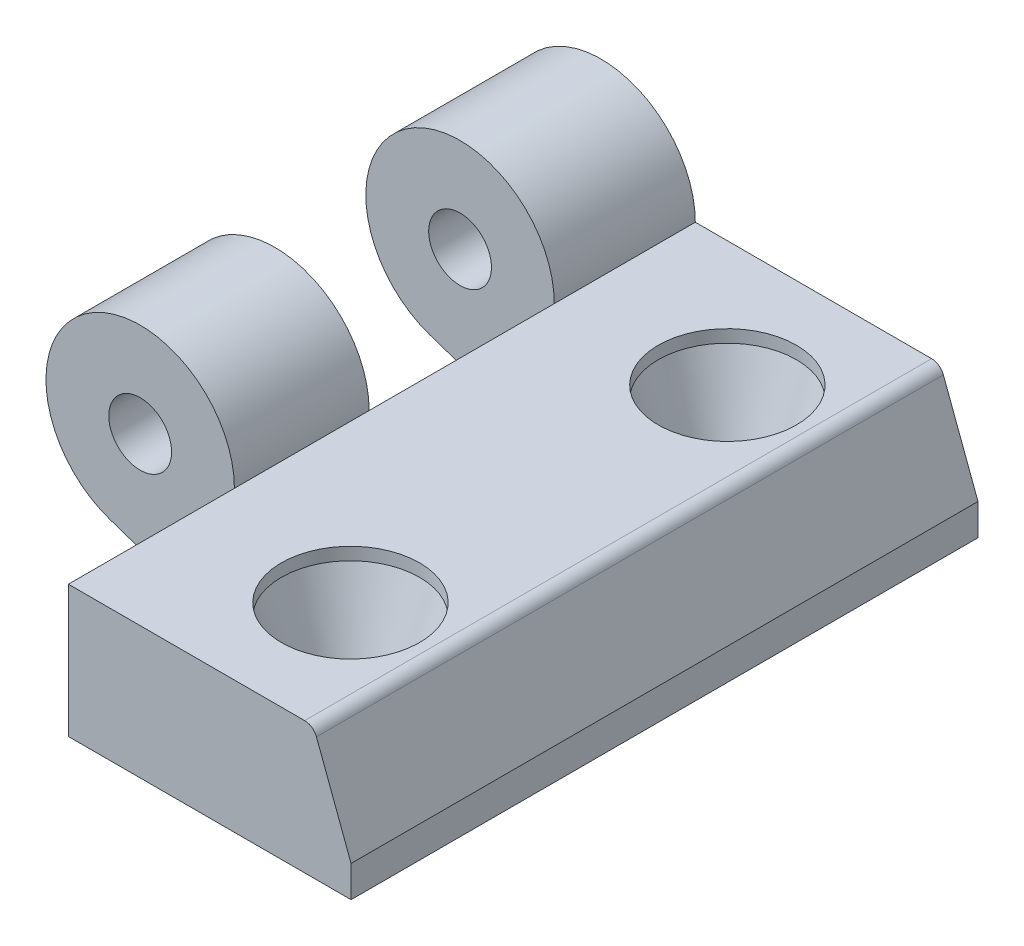
ISO-10303-21;
HEADER;
FILE_DESCRIPTION(('STEP AP214'),'2;1');
FILE_NAME('part.step','',(''),(''),'','','');
FILE_SCHEMA(('AUTOMOTIVE_DESIGN { 1 0 10303 214 1 1 1 1 }'));
ENDSEC;
DATA;
#1=APPLICATION_CONTEXT('core data for automotive mechanical design processes');
#2=APPLICATION_PROTOCOL_DEFINITION('international standard','automotive_design',2000,#1);
#3=PRODUCT_CONTEXT('',#1,'mechanical');
#4=PRODUCT('Part','Part','',(#3));
#5=PRODUCT_RELATED_PRODUCT_CATEGORY('part','',(#4));
#6=PRODUCT_DEFINITION_FORMATION('','',#4);
#7=PRODUCT_DEFINITION_CONTEXT('part definition',#1,'design');
#8=PRODUCT_DEFINITION('design','',#6,#7);
#9=PRODUCT_DEFINITION_SHAPE('','',#8);
#10=(LENGTH_UNIT() NAMED_UNIT(*) SI_UNIT(.MILLI.,.METRE.));
#11=(NAMED_UNIT(*) PLANE_ANGLE_UNIT() SI_UNIT($,.RADIAN.));
#12=(NAMED_UNIT(*) SI_UNIT($,.STERADIAN.) SOLID_ANGLE_UNIT());
#13=UNCERTAINTY_MEASURE_WITH_UNIT(LENGTH_MEASURE(1.E-05),#10,'distance_accuracy_value','');
#14=(GEOMETRIC_REPRESENTATION_CONTEXT(3) GLOBAL_UNCERTAINTY_ASSIGNED_CONTEXT((#13)) GLOBAL_UNIT_ASSIGNED_CONTEXT((#10,
#11,#12)) REPRESENTATION_CONTEXT('',''));
#15=CARTESIAN_POINT('',(0.,0.,0.));
#16=DIRECTION('',(0.,0.,1.));
#17=DIRECTION('',(1.,0.,0.));
#18=AXIS2_PLACEMENT_3D('',#15,#16,#17);
#19=CARTESIAN_POINT('',(20.,-10.5,-15.));
#20=DIRECTION('',(0.,-1.,0.));
#21=DIRECTION('',(0.,0.,-1.));
#22=AXIS2_PLACEMENT_3D('',#19,#20,#21);
#23=CYLINDRICAL_SURFACE('',#22,5.5);
#24=CARTESIAN_POINT('',(20.,0.,-15.));
#25=DIRECTION('',(0.,-1.,0.));
#26=DIRECTION('',(0.,0.,-1.));
#27=AXIS2_PLACEMENT_3D('',#24,#25,#26);
#28=CIRCLE('',#27,5.5);
#29=CARTESIAN_POINT('',(20.,0.,-20.5));
#30=VERTEX_POINT('',#29);
#31=EDGE_CURVE('E205',#30,#30,#28,.F.);
#32=ORIENTED_EDGE('',*,*,#31,.T.);
#33=EDGE_LOOP('',(#32));
#34=FACE_BOUND('',#33,.T.);
#35=CARTESIAN_POINT('',(20.,-1.0000000000332,-15.));
#36=DIRECTION('',(0.,1.,0.));
#37=DIRECTION('',(0.,0.,1.));
#38=AXIS2_PLACEMENT_3D('',#35,#36,#37);
#39=CIRCLE('',#38,5.49999999996885);
#40=CARTESIAN_POINT('',(20.,-1.0000000000332,-9.50000000003115));
#41=VERTEX_POINT('',#40);
#42=EDGE_CURVE('E247',#41,#41,#39,.F.);
#43=ORIENTED_EDGE('',*,*,#42,.T.);
#44=EDGE_LOOP('',(#43));
#45=FACE_BOUND('',#44,.T.);
#46=ADVANCED_FACE('F16',(#34,#45),#23,.F.);
#47=CARTESIAN_POINT('',(20.,-10.5,15.));
#48=DIRECTION('',(0.,-1.,0.));
#49=DIRECTION('',(0.,0.,-1.));
#50=AXIS2_PLACEMENT_3D('',#47,#48,#49);
#51=CYLINDRICAL_SURFACE('',#50,5.5);
#52=CARTESIAN_POINT('',(20.,0.,15.));
#53=DIRECTION('',(0.,-1.,0.));
#54=DIRECTION('',(0.,0.,-1.));
#55=AXIS2_PLACEMENT_3D('',#52,#53,#54);
#56=CIRCLE('',#55,5.5);
#57=CARTESIAN_POINT('',(20.,0.,9.5));
#58=VERTEX_POINT('',#57);
#59=EDGE_CURVE('E119',#58,#58,#56,.F.);
#60=ORIENTED_EDGE('',*,*,#59,.T.);
#61=EDGE_LOOP('',(#60));
#62=FACE_BOUND('',#61,.T.);
#63=CARTESIAN_POINT('',(20.,-1.0000000000332,15.));
#64=DIRECTION('',(0.,1.,0.));
#65=DIRECTION('',(0.,0.,1.));
#66=AXIS2_PLACEMENT_3D('',#63,#64,#65);
#67=CIRCLE('',#66,5.49999999996998);
#68=CARTESIAN_POINT('',(20.,-1.0000000000332,20.49999999997));
#69=VERTEX_POINT('',#68);
#70=EDGE_CURVE('E206',#69,#69,#67,.F.);
#71=ORIENTED_EDGE('',*,*,#70,.T.);
#72=EDGE_LOOP('',(#71));
#73=FACE_BOUND('',#72,.T.);
#74=ADVANCED_FACE('F468',(#62,#73),#51,.F.);
#75=CARTESIAN_POINT('',(26.3069995318356,-1.,24.95));
#76=DIRECTION('',(0.,0.,-1.));
#77=DIRECTION('',(-1.,0.,0.));
#78=AXIS2_PLACEMENT_3D('',#75,#76,#77);
#79=CYLINDRICAL_SURFACE('',#78,0.999999999999949);
#80=CARTESIAN_POINT('',(26.3069995318356,-1.,24.95));
#81=DIRECTION('',(0.,0.,-1.));
#82=DIRECTION('',(-1.,0.,0.));
#83=AXIS2_PLACEMENT_3D('',#80,#81,#82);
#84=CIRCLE('',#83,0.999999999999949);
#85=CARTESIAN_POINT('',(26.3069995318353,0.,24.95));
#86=VERTEX_POINT('',#85);
#87=CARTESIAN_POINT('',(27.2433287094045,-0.648876558411652,24.95));
#88=VERTEX_POINT('',#87);
#89=EDGE_CURVE('E109',#86,#88,#84,.T.);
#90=ORIENTED_EDGE('',*,*,#89,.T.);
#91=DIRECTION('',(0.,0.,1.));
#92=VECTOR('',#91,1.);
#93=CARTESIAN_POINT('',(27.2433287094045,-0.648876558411645,24.95));
#94=LINE('',#93,#92);
#95=CARTESIAN_POINT('',(27.2433287094045,-0.648876558411652,-24.95));
#96=VERTEX_POINT('',#95);
#97=EDGE_CURVE('E107',#88,#96,#94,.F.);
#98=ORIENTED_EDGE('',*,*,#97,.T.);
#99=CARTESIAN_POINT('',(26.3069995318356,-1.,-24.95));
#100=DIRECTION('',(0.,0.,-1.));
#101=DIRECTION('',(-1.,0.,0.));
#102=AXIS2_PLACEMENT_3D('',#99,#100,#101);
#103=CIRCLE('',#102,0.999999999999949);
#104=CARTESIAN_POINT('',(26.3069995318353,0.,-24.95));
#105=VERTEX_POINT('',#104);
#106=EDGE_CURVE('E19',#96,#105,#103,.F.);
#107=ORIENTED_EDGE('',*,*,#106,.T.);
#108=DIRECTION('',(0.,0.,-1.));
#109=VECTOR('',#108,1.);
#110=CARTESIAN_POINT('',(26.3069995318351,0.,24.95));
#111=LINE('',#110,#109);
#112=EDGE_CURVE('E104',#105,#86,#111,.F.);
#113=ORIENTED_EDGE('',*,*,#112,.T.);
#114=EDGE_LOOP('',(#90,#98,#107,#113));
#115=FACE_BOUND('',#114,.T.);
#116=ADVANCED_FACE('F103',(#115),#79,.T.);
#117=CARTESIAN_POINT('',(0.,0.,24.95));
#118=DIRECTION('',(0.,0.,-1.));
#119=DIRECTION('',(-1.,0.,0.));
#120=AXIS2_PLACEMENT_3D('',#117,#118,#119);
#121=CYLINDRICAL_SURFACE('',#120,2.5);
#122=CARTESIAN_POINT('',(0.,0.,11.735));
#123=DIRECTION('',(0.,0.,-1.));
#124=DIRECTION('',(-1.,0.,0.));
#125=AXIS2_PLACEMENT_3D('',#122,#123,#124);
#126=CIRCLE('',#125,2.5);
#127=CARTESIAN_POINT('',(-2.5,0.,11.735));
#128=VERTEX_POINT('',#127);
#129=EDGE_CURVE('E258',#128,#128,#126,.F.);
#130=ORIENTED_EDGE('',*,*,#129,.T.);
#131=EDGE_LOOP('',(#130));
#132=FACE_BOUND('',#131,.T.);
#133=CARTESIAN_POINT('',(0.,0.,1.01));
#134=DIRECTION('',(0.,0.,-1.));
#135=DIRECTION('',(-1.,0.,0.));
#136=AXIS2_PLACEMENT_3D('',#133,#134,#135);
#137=CIRCLE('',#136,2.5);
#138=CARTESIAN_POINT('',(-2.5,0.,1.01));
#139=VERTEX_POINT('',#138);
#140=EDGE_CURVE('E167',#139,#139,#137,.T.);
#141=ORIENTED_EDGE('',*,*,#140,.T.);
#142=EDGE_LOOP('',(#141));
#143=FACE_BOUND('',#142,.T.);
#144=ADVANCED_FACE('F326',(#132,#143),#121,.F.);
#145=CARTESIAN_POINT('',(20.,-1.0000000000332,-15.));
#146=DIRECTION('',(0.,1.,0.));
#147=DIRECTION('',(0.,0.,1.));
#148=AXIS2_PLACEMENT_3D('',#145,#146,#147);
#149=CONICAL_SURFACE('',#148,5.49999999996885,0.333244301114076);
#150=ORIENTED_EDGE('',*,*,#42,.F.);
#151=EDGE_LOOP('',(#150));
#152=FACE_BOUND('',#151,.T.);
#153=CARTESIAN_POINT('',(20.,-7.5,-15.));
#154=DIRECTION('',(0.,-1.,0.));
#155=DIRECTION('',(0.,0.,-1.));
#156=AXIS2_PLACEMENT_3D('',#153,#154,#155);
#157=CIRCLE('',#156,3.25);
#158=CARTESIAN_POINT('',(20.,-7.5,-18.25));
#159=VERTEX_POINT('',#158);
#160=EDGE_CURVE('E150',#159,#159,#157,.T.);
#161=ORIENTED_EDGE('',*,*,#160,.T.);
#162=EDGE_LOOP('',(#161));
#163=FACE_BOUND('',#162,.T.);
#164=ADVANCED_FACE('F329',(#152,#163),#149,.F.);
#165=CARTESIAN_POINT('',(20.,-1.0000000000332,15.));
#166=DIRECTION('',(0.,1.,0.));
#167=DIRECTION('',(0.,0.,1.));
#168=AXIS2_PLACEMENT_3D('',#165,#166,#167);
#169=CONICAL_SURFACE('',#168,5.49999999996998,0.333244301114076);
#170=ORIENTED_EDGE('',*,*,#70,.F.);
#171=EDGE_LOOP('',(#170));
#172=FACE_BOUND('',#171,.T.);
#173=CARTESIAN_POINT('',(20.,-7.5,15.));
#174=DIRECTION('',(0.,-1.,0.));
#175=DIRECTION('',(0.,0.,-1.));
#176=AXIS2_PLACEMENT_3D('',#173,#174,#175);
#177=CIRCLE('',#176,3.25);
#178=CARTESIAN_POINT('',(20.,-7.5,11.75));
#179=VERTEX_POINT('',#178);
#180=EDGE_CURVE('E235',#179,#179,#177,.T.);
#181=ORIENTED_EDGE('',*,*,#180,.T.);
#182=EDGE_LOOP('',(#181));
#183=FACE_BOUND('',#182,.T.);
#184=ADVANCED_FACE('F442',(#172,#183),#169,.F.);
#185=CARTESIAN_POINT('',(0.,0.,24.95));
#186=DIRECTION('',(0.,0.,-1.));
#187=DIRECTION('',(-1.,0.,0.));
#188=AXIS2_PLACEMENT_3D('',#185,#186,#187);
#189=CYLINDRICAL_SURFACE('',#188,2.5);
#190=CARTESIAN_POINT('',(0.,0.,-13.725));
#191=DIRECTION('',(0.,0.,-1.));
#192=DIRECTION('',(-1.,0.,0.));
#193=AXIS2_PLACEMENT_3D('',#190,#191,#192);
#194=CIRCLE('',#193,2.5);
#195=CARTESIAN_POINT('',(-2.5,0.,-13.725));
#196=VERTEX_POINT('',#195);
#197=EDGE_CURVE('E234',#196,#196,#194,.F.);
#198=ORIENTED_EDGE('',*,*,#197,.T.);
#199=EDGE_LOOP('',(#198));
#200=FACE_BOUND('',#199,.T.);
#201=CARTESIAN_POINT('',(0.,0.,-24.95));
#202=DIRECTION('',(0.,0.,-1.));
#203=DIRECTION('',(-1.,0.,0.));
#204=AXIS2_PLACEMENT_3D('',#201,#202,#203);
#205=CIRCLE('',#204,2.5);
#206=CARTESIAN_POINT('',(-2.5,0.,-24.95));
#207=VERTEX_POINT('',#206);
#208=EDGE_CURVE('E238',#207,#207,#205,.T.);
#209=ORIENTED_EDGE('',*,*,#208,.T.);
#210=EDGE_LOOP('',(#209));
#211=FACE_BOUND('',#210,.T.);
#212=ADVANCED_FACE('F435',(#200,#211),#189,.F.);
#213=CARTESIAN_POINT('',(23.6712328767128,8.8767123287668,24.95));
#214=DIRECTION('',(-0.936329177569051,-0.351123441588374,0.));
#215=DIRECTION('',(0.351123441588374,-0.936329177569051,0.));
#216=AXIS2_PLACEMENT_3D('',#213,#214,#215);
#217=PLANE('',#216);
#218=ORIENTED_EDGE('',*,*,#97,.F.);
#219=DIRECTION('',(-0.351123441588374,0.936329177569051,0.));
#220=VECTOR('',#219,1.);
#221=CARTESIAN_POINT('',(30.,-8.,24.95));
#222=LINE('',#221,#220);
#223=CARTESIAN_POINT('',(30.,-7.99999999999999,24.95));
#224=VERTEX_POINT('',#223);
#225=EDGE_CURVE('E209',#224,#88,#222,.T.);
#226=ORIENTED_EDGE('',*,*,#225,.F.);
#227=DIRECTION('',(0.,0.,-1.));
#228=VECTOR('',#227,1.);
#229=CARTESIAN_POINT('',(30.,-8.,24.95));
#230=LINE('',#229,#228);
#231=CARTESIAN_POINT('',(30.,-8.,-24.95));
#232=VERTEX_POINT('',#231);
#233=EDGE_CURVE('E130',#232,#224,#230,.F.);
#234=ORIENTED_EDGE('',*,*,#233,.F.);
#235=DIRECTION('',(-0.351123441588374,0.936329177569051,0.));
#236=VECTOR('',#235,1.);
#237=CARTESIAN_POINT('',(30.,-8.,-24.95));
#238=LINE('',#237,#236);
#239=EDGE_CURVE('E127',#232,#96,#238,.T.);
#240=ORIENTED_EDGE('',*,*,#239,.T.);
#241=EDGE_LOOP('',(#218,#226,#234,#240));
#242=FACE_BOUND('',#241,.T.);
#243=ADVANCED_FACE('F274',(#242),#217,.F.);
#244=CARTESIAN_POINT('',(0.,0.,24.95));
#245=DIRECTION('',(0.,-1.,0.));
#246=DIRECTION('',(0.,0.,-1.));
#247=AXIS2_PLACEMENT_3D('',#244,#245,#246);
#248=PLANE('',#247);
#249=DIRECTION('',(0.,0.,-1.));
#250=VECTOR('',#249,1.);
#251=CARTESIAN_POINT('',(7.50000000000099,0.,24.95));
#252=LINE('',#251,#250);
#253=CARTESIAN_POINT('',(7.50000000000099,0.,-13.725));
#254=VERTEX_POINT('',#253);
#255=CARTESIAN_POINT('',(7.50000000000049,0.,-24.95));
#256=VERTEX_POINT('',#255);
#257=EDGE_CURVE('E232',#254,#256,#252,.T.);
#258=ORIENTED_EDGE('',*,*,#257,.F.);
#259=DIRECTION('',(0.,0.,-1.));
#260=VECTOR('',#259,1.);
#261=CARTESIAN_POINT('',(7.50000000000099,0.,1.01));
#262=LINE('',#261,#260);
#263=CARTESIAN_POINT('',(7.5000000000005,0.,1.01));
#264=VERTEX_POINT('',#263);
#265=EDGE_CURVE('E177',#254,#264,#262,.F.);
#266=ORIENTED_EDGE('',*,*,#265,.T.);
#267=DIRECTION('',(0.,0.,-1.));
#268=VECTOR('',#267,1.);
#269=CARTESIAN_POINT('',(7.5,0.,24.95));
#270=LINE('',#269,#268);
#271=CARTESIAN_POINT('',(7.5,0.,11.735));
#272=VERTEX_POINT('',#271);
#273=EDGE_CURVE('E118',#272,#264,#270,.T.);
#274=ORIENTED_EDGE('',*,*,#273,.F.);
#275=DIRECTION('',(0.,0.,-1.));
#276=VECTOR('',#275,1.);
#277=CARTESIAN_POINT('',(7.5,0.,44.9099215504134));
#278=LINE('',#277,#276);
#279=CARTESIAN_POINT('',(7.5,0.,24.95));
#280=VERTEX_POINT('',#279);
#281=EDGE_CURVE('E151',#272,#280,#278,.F.);
#282=ORIENTED_EDGE('',*,*,#281,.T.);
#283=DIRECTION('',(1.,0.,0.));
#284=VECTOR('',#283,1.);
#285=CARTESIAN_POINT('',(0.,0.,24.95));
#286=LINE('',#285,#284);
#287=EDGE_CURVE('E117',#86,#280,#286,.F.);
#288=ORIENTED_EDGE('',*,*,#287,.F.);
#289=ORIENTED_EDGE('',*,*,#112,.F.);
#290=DIRECTION('',(1.,0.,0.));
#291=VECTOR('',#290,1.);
#292=CARTESIAN_POINT('',(0.,0.,-24.95));
#293=LINE('',#292,#291);
#294=EDGE_CURVE('E115',#105,#256,#293,.F.);
#295=ORIENTED_EDGE('',*,*,#294,.T.);
#296=EDGE_LOOP('',(#258,#266,#274,#282,#288,#289,#295));
#297=FACE_BOUND('',#296,.T.);
#298=ORIENTED_EDGE('',*,*,#59,.F.);
#299=EDGE_LOOP('',(#298));
#300=FACE_BOUND('',#299,.T.);
#301=ORIENTED_EDGE('',*,*,#31,.F.);
#302=EDGE_LOOP('',(#301));
#303=FACE_BOUND('',#302,.T.);
#304=ADVANCED_FACE('F113',(#297,#300,#303),#248,.F.);
#305=CARTESIAN_POINT('',(0.,0.,24.95));
#306=DIRECTION('',(0.,0.,-1.));
#307=DIRECTION('',(-1.,0.,0.));
#308=AXIS2_PLACEMENT_3D('',#305,#306,#307);
#309=CYLINDRICAL_SURFACE('',#308,7.5);
#310=CARTESIAN_POINT('',(0.,0.,-24.95));
#311=DIRECTION('',(0.,0.,-1.));
#312=DIRECTION('',(-1.,0.,0.));
#313=AXIS2_PLACEMENT_3D('',#310,#311,#312);
#314=CIRCLE('',#313,7.5);
#315=CARTESIAN_POINT('',(-2.42260751675987,-7.09795553802205,-24.95));
#316=VERTEX_POINT('',#315);
#317=EDGE_CURVE('E124',#256,#316,#314,.F.);
#318=ORIENTED_EDGE('',*,*,#317,.T.);
#319=DIRECTION('',(0.,0.,1.));
#320=VECTOR('',#319,1.);
#321=CARTESIAN_POINT('',(-2.42260751675985,-7.09795553802201,24.95));
#322=LINE('',#321,#320);
#323=CARTESIAN_POINT('',(-2.42260751675987,-7.09795553802205,-13.725));
#324=VERTEX_POINT('',#323);
#325=EDGE_CURVE('E182',#316,#324,#322,.T.);
#326=ORIENTED_EDGE('',*,*,#325,.T.);
#327=CARTESIAN_POINT('',(0.,0.,-13.725));
#328=DIRECTION('',(0.,0.,-1.));
#329=DIRECTION('',(-1.,0.,0.));
#330=AXIS2_PLACEMENT_3D('',#327,#328,#329);
#331=CIRCLE('',#330,7.5);
#332=EDGE_CURVE('E178',#324,#254,#331,.T.);
#333=ORIENTED_EDGE('',*,*,#332,.T.);
#334=ORIENTED_EDGE('',*,*,#257,.T.);
#335=EDGE_LOOP('',(#318,#326,#333,#334));
#336=FACE_BOUND('',#335,.T.);
#337=ADVANCED_FACE('F301',(#336),#309,.T.);
#338=CARTESIAN_POINT('',(7.50000000000099,-10.5,-13.725));
#339=DIRECTION('',(0.,0.,-1.));
#340=DIRECTION('',(-1.,0.,0.));
#341=AXIS2_PLACEMENT_3D('',#338,#339,#340);
#342=PLANE('',#341);
#343=DIRECTION('',(-0.946692296193091,0.322139249903909,0.));
#344=VECTOR('',#343,1.);
#345=CARTESIAN_POINT('',(-2.41604334176732,-7.1001891871357,-13.725));
#346=LINE('',#345,#344);
#347=CARTESIAN_POINT('',(7.50000000000099,-10.4744077975303,-13.725));
#348=VERTEX_POINT('',#347);
#349=EDGE_CURVE('E171',#324,#348,#346,.F.);
#350=ORIENTED_EDGE('',*,*,#349,.T.);
#351=DIRECTION('',(0.,1.,0.));
#352=VECTOR('',#351,1.);
#353=CARTESIAN_POINT('',(7.50000000000099,-10.5,-13.725));
#354=LINE('',#353,#352);
#355=EDGE_CURVE('E174',#348,#254,#354,.T.);
#356=ORIENTED_EDGE('',*,*,#355,.T.);
#357=ORIENTED_EDGE('',*,*,#332,.F.);
#358=EDGE_LOOP('',(#350,#356,#357));
#359=FACE_BOUND('',#358,.T.);
#360=ORIENTED_EDGE('',*,*,#197,.F.);
#361=EDGE_LOOP('',(#360));
#362=FACE_BOUND('',#361,.T.);
#363=ADVANCED_FACE('F303',(#359,#362),#342,.F.);
#364=CARTESIAN_POINT('',(7.50000000000099,-10.5,1.01));
#365=DIRECTION('',(1.,0.,0.));
#366=DIRECTION('',(0.,0.,-1.));
#367=AXIS2_PLACEMENT_3D('',#364,#365,#366);
#368=PLANE('',#367);
#369=ORIENTED_EDGE('',*,*,#355,.F.);
#370=DIRECTION('',(0.,0.,1.));
#371=VECTOR('',#370,1.);
#372=CARTESIAN_POINT('',(7.50000000000099,-10.4744077975303,24.95));
#373=LINE('',#372,#371);
#374=CARTESIAN_POINT('',(7.50000000000099,-10.4744077975303,1.01));
#375=VERTEX_POINT('',#374);
#376=EDGE_CURVE('E160',#348,#375,#373,.T.);
#377=ORIENTED_EDGE('',*,*,#376,.T.);
#378=DIRECTION('',(0.,1.,0.));
#379=VECTOR('',#378,1.);
#380=CARTESIAN_POINT('',(7.50000000000099,-10.5,1.01));
#381=LINE('',#380,#379);
#382=EDGE_CURVE('E163',#375,#264,#381,.T.);
#383=ORIENTED_EDGE('',*,*,#382,.T.);
#384=ORIENTED_EDGE('',*,*,#265,.F.);
#385=EDGE_LOOP('',(#369,#377,#383,#384));
#386=FACE_BOUND('',#385,.T.);
#387=ADVANCED_FACE('F309',(#386),#368,.F.);
#388=CARTESIAN_POINT('',(7.50000000000099,-10.5,1.01));
#389=DIRECTION('',(0.,0.,1.));
#390=DIRECTION('',(1.,0.,0.));
#391=AXIS2_PLACEMENT_3D('',#388,#389,#390);
#392=PLANE('',#391);
#393=DIRECTION('',(-0.946692296193091,0.322139249903909,0.));
#394=VECTOR('',#393,1.);
#395=CARTESIAN_POINT('',(-2.41604334176732,-7.1001891871357,1.01));
#396=LINE('',#395,#394);
#397=CARTESIAN_POINT('',(-2.42260751675985,-7.09795553802201,1.01));
#398=VERTEX_POINT('',#397);
#399=EDGE_CURVE('E142',#375,#398,#396,.T.);
#400=ORIENTED_EDGE('',*,*,#399,.T.);
#401=CARTESIAN_POINT('',(0.,0.,1.01));
#402=DIRECTION('',(0.,0.,-1.));
#403=DIRECTION('',(-1.,0.,0.));
#404=AXIS2_PLACEMENT_3D('',#401,#402,#403);
#405=CIRCLE('',#404,7.5);
#406=EDGE_CURVE('E166',#264,#398,#405,.F.);
#407=ORIENTED_EDGE('',*,*,#406,.F.);
#408=ORIENTED_EDGE('',*,*,#382,.F.);
#409=EDGE_LOOP('',(#400,#407,#408));
#410=FACE_BOUND('',#409,.T.);
#411=ORIENTED_EDGE('',*,*,#140,.F.);
#412=EDGE_LOOP('',(#411));
#413=FACE_BOUND('',#412,.T.);
#414=ADVANCED_FACE('F313',(#410,#413),#392,.F.);
#415=CARTESIAN_POINT('',(0.,0.,24.95));
#416=DIRECTION('',(0.,0.,-1.));
#417=DIRECTION('',(-1.,0.,0.));
#418=AXIS2_PLACEMENT_3D('',#415,#416,#417);
#419=CYLINDRICAL_SURFACE('',#418,7.5);
#420=ORIENTED_EDGE('',*,*,#406,.T.);
#421=DIRECTION('',(0.,0.,1.));
#422=VECTOR('',#421,1.);
#423=CARTESIAN_POINT('',(-2.42260751675985,-7.09795553802201,24.95));
#424=LINE('',#423,#422);
#425=CARTESIAN_POINT('',(-2.42260751675987,-7.09795553802205,11.735));
#426=VERTEX_POINT('',#425);
#427=EDGE_CURVE('E139',#398,#426,#424,.T.);
#428=ORIENTED_EDGE('',*,*,#427,.T.);
#429=CARTESIAN_POINT('',(0.,0.,11.735));
#430=DIRECTION('',(0.,0.,-1.));
#431=DIRECTION('',(-1.,0.,0.));
#432=AXIS2_PLACEMENT_3D('',#429,#430,#431);
#433=CIRCLE('',#432,7.5);
#434=EDGE_CURVE('E224',#426,#272,#433,.T.);
#435=ORIENTED_EDGE('',*,*,#434,.T.);
#436=ORIENTED_EDGE('',*,*,#273,.T.);
#437=EDGE_LOOP('',(#420,#428,#435,#436));
#438=FACE_BOUND('',#437,.T.);
#439=ADVANCED_FACE('F318',(#438),#419,.T.);
#440=CARTESIAN_POINT('',(7.5,-10.5,11.735));
#441=DIRECTION('',(0.,0.,-1.));
#442=DIRECTION('',(-1.,0.,0.));
#443=AXIS2_PLACEMENT_3D('',#440,#441,#442);
#444=PLANE('',#443);
#445=DIRECTION('',(-0.946692296193091,0.322139249903909,0.));
#446=VECTOR('',#445,1.);
#447=CARTESIAN_POINT('',(-2.41604334176732,-7.1001891871357,11.735));
#448=LINE('',#447,#446);
#449=CARTESIAN_POINT('',(7.5,-10.4744077975299,11.735));
#450=VERTEX_POINT('',#449);
#451=EDGE_CURVE('E141',#426,#450,#448,.F.);
#452=ORIENTED_EDGE('',*,*,#451,.T.);
#453=DIRECTION('',(0.,1.,0.));
#454=VECTOR('',#453,1.);
#455=CARTESIAN_POINT('',(7.5,-10.5,11.735));
#456=LINE('',#455,#454);
#457=EDGE_CURVE('E147',#450,#272,#456,.T.);
#458=ORIENTED_EDGE('',*,*,#457,.T.);
#459=ORIENTED_EDGE('',*,*,#434,.F.);
#460=EDGE_LOOP('',(#452,#458,#459));
#461=FACE_BOUND('',#460,.T.);
#462=ORIENTED_EDGE('',*,*,#129,.F.);
#463=EDGE_LOOP('',(#462));
#464=FACE_BOUND('',#463,.T.);
#465=ADVANCED_FACE('F320',(#461,#464),#444,.F.);
#466=CARTESIAN_POINT('',(7.5,-10.5,44.9099215504134));
#467=DIRECTION('',(1.,0.,0.));
#468=DIRECTION('',(0.,0.,-1.));
#469=AXIS2_PLACEMENT_3D('',#466,#467,#468);
#470=PLANE('',#469);
#471=DIRECTION('',(0.,0.,1.));
#472=VECTOR('',#471,1.);
#473=CARTESIAN_POINT('',(7.50000000000001,-10.4744077975299,24.95));
#474=LINE('',#473,#472);
#475=CARTESIAN_POINT('',(7.5,-10.4744077975299,24.95));
#476=VERTEX_POINT('',#475);
#477=EDGE_CURVE('E144',#450,#476,#474,.T.);
#478=ORIENTED_EDGE('',*,*,#477,.T.);
#479=DIRECTION('',(0.,1.,0.));
#480=VECTOR('',#479,1.);
#481=CARTESIAN_POINT('',(7.5,0.,24.95));
#482=LINE('',#481,#480);
#483=EDGE_CURVE('E199',#280,#476,#482,.F.);
#484=ORIENTED_EDGE('',*,*,#483,.F.);
#485=ORIENTED_EDGE('',*,*,#281,.F.);
#486=ORIENTED_EDGE('',*,*,#457,.F.);
#487=EDGE_LOOP('',(#478,#484,#485,#486));
#488=FACE_BOUND('',#487,.T.);
#489=ADVANCED_FACE('F285',(#488),#470,.F.);
#490=CARTESIAN_POINT('',(20.,-10.5,-15.));
#491=DIRECTION('',(0.,-1.,0.));
#492=DIRECTION('',(0.,0.,-1.));
#493=AXIS2_PLACEMENT_3D('',#490,#491,#492);
#494=CYLINDRICAL_SURFACE('',#493,3.25);
#495=CARTESIAN_POINT('',(20.,-10.5,-15.));
#496=DIRECTION('',(0.,-1.,0.));
#497=DIRECTION('',(0.,0.,-1.));
#498=AXIS2_PLACEMENT_3D('',#495,#496,#497);
#499=CIRCLE('',#498,3.25);
#500=CARTESIAN_POINT('',(20.,-10.5,-18.25));
#501=VERTEX_POINT('',#500);
#502=EDGE_CURVE('E156',#501,#501,#499,.F.);
#503=ORIENTED_EDGE('',*,*,#502,.F.);
#504=EDGE_LOOP('',(#503));
#505=FACE_BOUND('',#504,.T.);
#506=ORIENTED_EDGE('',*,*,#160,.F.);
#507=EDGE_LOOP('',(#506));
#508=FACE_BOUND('',#507,.T.);
#509=ADVANCED_FACE('F357',(#505,#508),#494,.F.);
#510=CARTESIAN_POINT('',(20.,-10.5,15.));
#511=DIRECTION('',(0.,-1.,0.));
#512=DIRECTION('',(0.,0.,-1.));
#513=AXIS2_PLACEMENT_3D('',#510,#511,#512);
#514=CYLINDRICAL_SURFACE('',#513,3.25);
#515=CARTESIAN_POINT('',(20.,-10.5,15.));
#516=DIRECTION('',(0.,-1.,0.));
#517=DIRECTION('',(0.,0.,-1.));
#518=AXIS2_PLACEMENT_3D('',#515,#516,#517);
#519=CIRCLE('',#518,3.25);
#520=CARTESIAN_POINT('',(20.,-10.5,11.75));
#521=VERTEX_POINT('',#520);
#522=EDGE_CURVE('E194',#521,#521,#519,.F.);
#523=ORIENTED_EDGE('',*,*,#522,.F.);
#524=EDGE_LOOP('',(#523));
#525=FACE_BOUND('',#524,.T.);
#526=ORIENTED_EDGE('',*,*,#180,.F.);
#527=EDGE_LOOP('',(#526));
#528=FACE_BOUND('',#527,.T.);
#529=ADVANCED_FACE('F354',(#525,#528),#514,.F.);
#530=CARTESIAN_POINT('',(0.,0.,-24.95));
#531=DIRECTION('',(0.,0.,1.));
#532=DIRECTION('',(1.,0.,0.));
#533=AXIS2_PLACEMENT_3D('',#530,#531,#532);
#534=PLANE('',#533);
#535=ORIENTED_EDGE('',*,*,#106,.F.);
#536=ORIENTED_EDGE('',*,*,#239,.F.);
#537=DIRECTION('',(0.,1.,0.));
#538=VECTOR('',#537,1.);
#539=CARTESIAN_POINT('',(30.,0.,-24.95));
#540=LINE('',#539,#538);
#541=CARTESIAN_POINT('',(30.,-10.5,-24.95));
#542=VERTEX_POINT('',#541);
#543=EDGE_CURVE('E126',#542,#232,#540,.T.);
#544=ORIENTED_EDGE('',*,*,#543,.F.);
#545=DIRECTION('',(1.,0.,0.));
#546=VECTOR('',#545,1.);
#547=CARTESIAN_POINT('',(0.,-10.5,-24.95));
#548=LINE('',#547,#546);
#549=CARTESIAN_POINT('',(7.57520952795494,-10.5,-24.95));
#550=VERTEX_POINT('',#549);
#551=EDGE_CURVE('E190',#550,#542,#548,.T.);
#552=ORIENTED_EDGE('',*,*,#551,.F.);
#553=DIRECTION('',(-0.946692296193091,0.322139249903909,0.));
#554=VECTOR('',#553,1.);
#555=CARTESIAN_POINT('',(-2.41604334176732,-7.1001891871357,-24.95));
#556=LINE('',#555,#554);
#557=EDGE_CURVE('E186',#550,#316,#556,.T.);
#558=ORIENTED_EDGE('',*,*,#557,.T.);
#559=ORIENTED_EDGE('',*,*,#317,.F.);
#560=ORIENTED_EDGE('',*,*,#294,.F.);
#561=EDGE_LOOP('',(#535,#536,#544,#552,#558,#559,#560));
#562=FACE_BOUND('',#561,.T.);
#563=ORIENTED_EDGE('',*,*,#208,.F.);
#564=EDGE_LOOP('',(#563));
#565=FACE_BOUND('',#564,.T.);
#566=ADVANCED_FACE('F121',(#562,#565),#534,.F.);
#567=CARTESIAN_POINT('',(30.,0.,24.95));
#568=DIRECTION('',(1.,0.,0.));
#569=DIRECTION('',(0.,0.,-1.));
#570=AXIS2_PLACEMENT_3D('',#567,#568,#569);
#571=PLANE('',#570);
#572=DIRECTION('',(0.,1.,0.));
#573=VECTOR('',#572,1.);
#574=CARTESIAN_POINT('',(30.,0.,24.95));
#575=LINE('',#574,#573);
#576=CARTESIAN_POINT('',(30.,-10.5,24.95));
#577=VERTEX_POINT('',#576);
#578=EDGE_CURVE('E201',#577,#224,#575,.T.);
#579=ORIENTED_EDGE('',*,*,#578,.F.);
#580=DIRECTION('',(0.,0.,-1.));
#581=VECTOR('',#580,1.);
#582=CARTESIAN_POINT('',(30.,-10.5,24.95));
#583=LINE('',#582,#581);
#584=EDGE_CURVE('E193',#542,#577,#583,.F.);
#585=ORIENTED_EDGE('',*,*,#584,.F.);
#586=ORIENTED_EDGE('',*,*,#543,.T.);
#587=ORIENTED_EDGE('',*,*,#233,.T.);
#588=EDGE_LOOP('',(#579,#585,#586,#587));
#589=FACE_BOUND('',#588,.T.);
#590=ADVANCED_FACE('F296',(#589),#571,.T.);
#591=CARTESIAN_POINT('',(0.,0.,24.95));
#592=DIRECTION('',(0.,0.,1.));
#593=DIRECTION('',(1.,0.,0.));
#594=AXIS2_PLACEMENT_3D('',#591,#592,#593);
#595=PLANE('',#594);
#596=ORIENTED_EDGE('',*,*,#89,.F.);
#597=ORIENTED_EDGE('',*,*,#287,.T.);
#598=ORIENTED_EDGE('',*,*,#483,.T.);
#599=DIRECTION('',(-0.946692296193091,0.322139249903909,0.));
#600=VECTOR('',#599,1.);
#601=CARTESIAN_POINT('',(-2.41604334176732,-7.1001891871357,24.95));
#602=LINE('',#601,#600);
#603=CARTESIAN_POINT('',(7.57520952795494,-10.5,24.95));
#604=VERTEX_POINT('',#603);
#605=EDGE_CURVE('E34',#476,#604,#602,.F.);
#606=ORIENTED_EDGE('',*,*,#605,.T.);
#607=DIRECTION('',(1.,0.,0.));
#608=VECTOR('',#607,1.);
#609=CARTESIAN_POINT('',(0.,-10.5,24.95));
#610=LINE('',#609,#608);
#611=EDGE_CURVE('E25',#577,#604,#610,.F.);
#612=ORIENTED_EDGE('',*,*,#611,.F.);
#613=ORIENTED_EDGE('',*,*,#578,.T.);
#614=ORIENTED_EDGE('',*,*,#225,.T.);
#615=EDGE_LOOP('',(#596,#597,#598,#606,#612,#613,#614));
#616=FACE_BOUND('',#615,.T.);
#617=ADVANCED_FACE('F276',(#616),#595,.T.);
#618=CARTESIAN_POINT('',(-2.41604334176732,-7.1001891871357,24.95));
#619=DIRECTION('',(0.322139249903909,0.946692296193091,0.));
#620=DIRECTION('',(-0.946692296193091,0.322139249903909,0.));
#621=AXIS2_PLACEMENT_3D('',#618,#619,#620);
#622=PLANE('',#621);
#623=ORIENTED_EDGE('',*,*,#451,.F.);
#624=ORIENTED_EDGE('',*,*,#427,.F.);
#625=ORIENTED_EDGE('',*,*,#399,.F.);
#626=ORIENTED_EDGE('',*,*,#376,.F.);
#627=ORIENTED_EDGE('',*,*,#349,.F.);
#628=ORIENTED_EDGE('',*,*,#325,.F.);
#629=ORIENTED_EDGE('',*,*,#557,.F.);
#630=DIRECTION('',(0.,0.,-1.));
#631=VECTOR('',#630,1.);
#632=CARTESIAN_POINT('',(7.57520952795494,-10.5,24.95));
#633=LINE('',#632,#631);
#634=EDGE_CURVE('E10',#604,#550,#633,.T.);
#635=ORIENTED_EDGE('',*,*,#634,.F.);
#636=ORIENTED_EDGE('',*,*,#605,.F.);
#637=ORIENTED_EDGE('',*,*,#477,.F.);
#638=EDGE_LOOP('',(#623,#624,#625,#626,#627,#628,#629,#635,#636,#637));
#639=FACE_BOUND('',#638,.T.);
#640=ADVANCED_FACE('F288',(#639),#622,.F.);
#641=CARTESIAN_POINT('',(0.,-10.5,24.95));
#642=DIRECTION('',(0.,-1.,0.));
#643=DIRECTION('',(0.,0.,-1.));
#644=AXIS2_PLACEMENT_3D('',#641,#642,#643);
#645=PLANE('',#644);
#646=ORIENTED_EDGE('',*,*,#611,.T.);
#647=ORIENTED_EDGE('',*,*,#634,.T.);
#648=ORIENTED_EDGE('',*,*,#551,.T.);
#649=ORIENTED_EDGE('',*,*,#584,.T.);
#650=EDGE_LOOP('',(#646,#647,#648,#649));
#651=FACE_BOUND('',#650,.T.);
#652=ORIENTED_EDGE('',*,*,#522,.T.);
#653=EDGE_LOOP('',(#652));
#654=FACE_BOUND('',#653,.T.);
#655=ORIENTED_EDGE('',*,*,#502,.T.);
#656=EDGE_LOOP('',(#655));
#657=FACE_BOUND('',#656,.T.);
#658=ADVANCED_FACE('F292',(#651,#654,#657),#645,.T.);
#659=CLOSED_SHELL('',(#46,#74,#116,#144,#164,#184,#212,#243,#304,#337,#363,#387,#414,#439,#465,
#489,#509,#529,#566,#590,#617,#640,#658));
#660=MANIFOLD_SOLID_BREP('B1',#659);
#661=ADVANCED_BREP_SHAPE_REPRESENTATION('',(#18,#660),#14);
#662=SHAPE_DEFINITION_REPRESENTATION(#9,#661);
ENDSEC;
END-ISO-10303-21;
